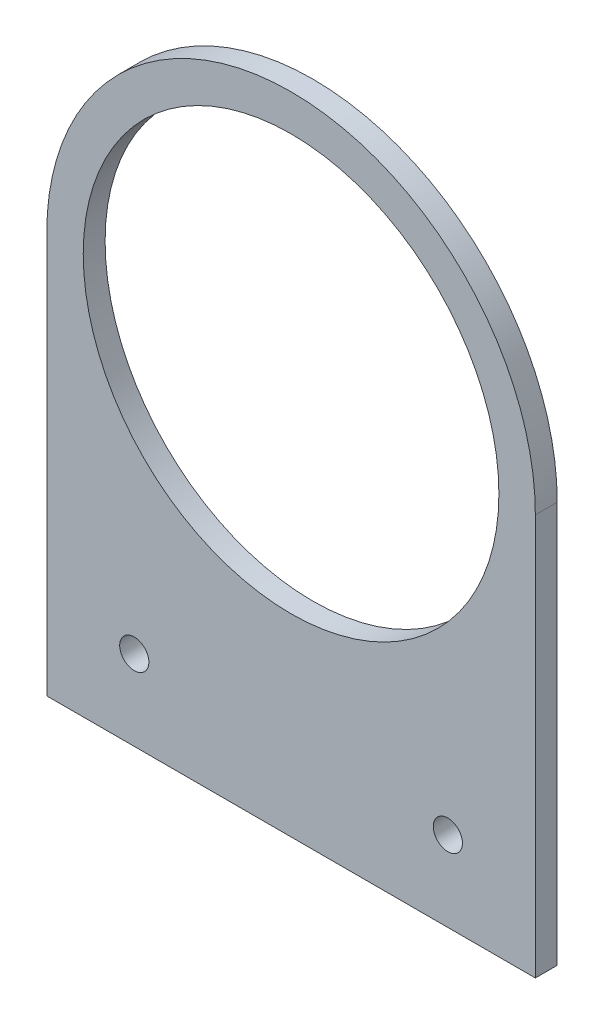
ISO-10303-21;
HEADER;
FILE_DESCRIPTION(('STEP AP214'),'2;1');
FILE_NAME('part.step','',(''),(''),'','','');
FILE_SCHEMA(('AUTOMOTIVE_DESIGN { 1 0 10303 214 1 1 1 1 }'));
ENDSEC;
DATA;
#1=APPLICATION_CONTEXT('core data for automotive mechanical design processes');
#2=APPLICATION_PROTOCOL_DEFINITION('international standard','automotive_design',2000,#1);
#3=PRODUCT_CONTEXT('',#1,'mechanical');
#4=PRODUCT('Part','Part','',(#3));
#5=PRODUCT_RELATED_PRODUCT_CATEGORY('part','',(#4));
#6=PRODUCT_DEFINITION_FORMATION('','',#4);
#7=PRODUCT_DEFINITION_CONTEXT('part definition',#1,'design');
#8=PRODUCT_DEFINITION('design','',#6,#7);
#9=PRODUCT_DEFINITION_SHAPE('','',#8);
#10=(LENGTH_UNIT() NAMED_UNIT(*) SI_UNIT(.MILLI.,.METRE.));
#11=(NAMED_UNIT(*) PLANE_ANGLE_UNIT() SI_UNIT($,.RADIAN.));
#12=(NAMED_UNIT(*) SI_UNIT($,.STERADIAN.) SOLID_ANGLE_UNIT());
#13=UNCERTAINTY_MEASURE_WITH_UNIT(LENGTH_MEASURE(1.E-05),#10,'distance_accuracy_value','');
#14=(GEOMETRIC_REPRESENTATION_CONTEXT(3) GLOBAL_UNCERTAINTY_ASSIGNED_CONTEXT((#13)) GLOBAL_UNIT_ASSIGNED_CONTEXT((#10,
#11,#12)) REPRESENTATION_CONTEXT('',''));
#15=CARTESIAN_POINT('',(0.,0.,0.));
#16=DIRECTION('',(0.,0.,1.));
#17=DIRECTION('',(1.,0.,0.));
#18=AXIS2_PLACEMENT_3D('',#15,#16,#17);
#19=CARTESIAN_POINT('',(0.,55.,3.));
#20=DIRECTION('',(0.,0.,1.));
#21=DIRECTION('',(1.,0.,0.));
#22=AXIS2_PLACEMENT_3D('',#19,#20,#21);
#23=PLANE('',#22);
#24=CARTESIAN_POINT('',(-21.5,11.,3.));
#25=DIRECTION('',(0.,0.,1.));
#26=DIRECTION('',(1.,0.,0.));
#27=AXIS2_PLACEMENT_3D('',#24,#25,#26);
#28=CIRCLE('',#27,2.);
#29=CARTESIAN_POINT('',(-19.5,11.,3.));
#30=VERTEX_POINT('',#29);
#31=EDGE_CURVE('E125',#30,#30,#28,.T.);
#32=ORIENTED_EDGE('',*,*,#31,.F.);
#33=EDGE_LOOP('',(#32));
#34=FACE_BOUND('',#33,.T.);
#35=DIRECTION('',(0.,-1.,0.));
#36=VECTOR('',#35,1.);
#37=CARTESIAN_POINT('',(-33.5,55.,3.));
#38=LINE('',#37,#36);
#39=CARTESIAN_POINT('',(-33.5,55.,3.));
#40=VERTEX_POINT('',#39);
#41=CARTESIAN_POINT('',(-33.5,0.,3.));
#42=VERTEX_POINT('',#41);
#43=EDGE_CURVE('E95',#40,#42,#38,.T.);
#44=ORIENTED_EDGE('',*,*,#43,.T.);
#45=DIRECTION('',(1.,0.,0.));
#46=VECTOR('',#45,1.);
#47=CARTESIAN_POINT('',(-33.5,0.,3.));
#48=LINE('',#47,#46);
#49=CARTESIAN_POINT('',(33.5,0.,3.));
#50=VERTEX_POINT('',#49);
#51=EDGE_CURVE('E90',#42,#50,#48,.T.);
#52=ORIENTED_EDGE('',*,*,#51,.T.);
#53=DIRECTION('',(0.,1.,0.));
#54=VECTOR('',#53,1.);
#55=CARTESIAN_POINT('',(33.5,0.,3.));
#56=LINE('',#55,#54);
#57=CARTESIAN_POINT('',(33.5,55.,3.));
#58=VERTEX_POINT('',#57);
#59=EDGE_CURVE('E93',#50,#58,#56,.T.);
#60=ORIENTED_EDGE('',*,*,#59,.T.);
#61=CARTESIAN_POINT('',(0.,55.,3.));
#62=DIRECTION('',(0.,0.,1.));
#63=DIRECTION('',(1.,0.,0.));
#64=AXIS2_PLACEMENT_3D('',#61,#62,#63);
#65=CIRCLE('',#64,33.5);
#66=EDGE_CURVE('E60',#58,#40,#65,.T.);
#67=ORIENTED_EDGE('',*,*,#66,.T.);
#68=EDGE_LOOP('',(#44,#52,#60,#67));
#69=FACE_BOUND('',#68,.T.);
#70=CARTESIAN_POINT('',(0.,55.,3.));
#71=DIRECTION('',(0.,0.,1.));
#72=DIRECTION('',(1.,0.,0.));
#73=AXIS2_PLACEMENT_3D('',#70,#71,#72);
#74=CIRCLE('',#73,28.5);
#75=CARTESIAN_POINT('',(28.5,55.,3.));
#76=VERTEX_POINT('',#75);
#77=EDGE_CURVE('E110',#76,#76,#74,.T.);
#78=ORIENTED_EDGE('',*,*,#77,.F.);
#79=EDGE_LOOP('',(#78));
#80=FACE_BOUND('',#79,.T.);
#81=CARTESIAN_POINT('',(21.5,11.,3.));
#82=DIRECTION('',(0.,0.,1.));
#83=DIRECTION('',(-1.,0.,0.));
#84=AXIS2_PLACEMENT_3D('',#81,#82,#83);
#85=CIRCLE('',#84,2.);
#86=CARTESIAN_POINT('',(19.5,11.,3.));
#87=VERTEX_POINT('',#86);
#88=EDGE_CURVE('E131',#87,#87,#85,.T.);
#89=ORIENTED_EDGE('',*,*,#88,.F.);
#90=EDGE_LOOP('',(#89));
#91=FACE_BOUND('',#90,.T.);
#92=ADVANCED_FACE('F43',(#34,#69,#80,#91),#23,.T.);
#93=CARTESIAN_POINT('',(0.,55.,0.));
#94=DIRECTION('',(0.,0.,1.));
#95=DIRECTION('',(1.,0.,0.));
#96=AXIS2_PLACEMENT_3D('',#93,#94,#95);
#97=PLANE('',#96);
#98=DIRECTION('',(0.,-1.,0.));
#99=VECTOR('',#98,1.);
#100=CARTESIAN_POINT('',(-33.5,55.,0.));
#101=LINE('',#100,#99);
#102=CARTESIAN_POINT('',(-33.5,55.,0.));
#103=VERTEX_POINT('',#102);
#104=CARTESIAN_POINT('',(-33.5,0.,0.));
#105=VERTEX_POINT('',#104);
#106=EDGE_CURVE('E107',#103,#105,#101,.T.);
#107=ORIENTED_EDGE('',*,*,#106,.F.);
#108=CARTESIAN_POINT('',(0.,55.,0.));
#109=DIRECTION('',(0.,0.,1.));
#110=DIRECTION('',(1.,0.,0.));
#111=AXIS2_PLACEMENT_3D('',#108,#109,#110);
#112=CIRCLE('',#111,33.5);
#113=CARTESIAN_POINT('',(33.5,55.,0.));
#114=VERTEX_POINT('',#113);
#115=EDGE_CURVE('E83',#114,#103,#112,.T.);
#116=ORIENTED_EDGE('',*,*,#115,.F.);
#117=DIRECTION('',(0.,1.,0.));
#118=VECTOR('',#117,1.);
#119=CARTESIAN_POINT('',(33.5,0.,0.));
#120=LINE('',#119,#118);
#121=CARTESIAN_POINT('',(33.5,0.,0.));
#122=VERTEX_POINT('',#121);
#123=EDGE_CURVE('E77',#122,#114,#120,.T.);
#124=ORIENTED_EDGE('',*,*,#123,.F.);
#125=DIRECTION('',(1.,0.,0.));
#126=VECTOR('',#125,1.);
#127=CARTESIAN_POINT('',(-33.5,0.,0.));
#128=LINE('',#127,#126);
#129=EDGE_CURVE('E99',#105,#122,#128,.T.);
#130=ORIENTED_EDGE('',*,*,#129,.F.);
#131=EDGE_LOOP('',(#107,#116,#124,#130));
#132=FACE_BOUND('',#131,.T.);
#133=CARTESIAN_POINT('',(0.,55.,0.));
#134=DIRECTION('',(0.,0.,1.));
#135=DIRECTION('',(1.,0.,0.));
#136=AXIS2_PLACEMENT_3D('',#133,#134,#135);
#137=CIRCLE('',#136,28.5);
#138=CARTESIAN_POINT('',(28.5,55.,0.));
#139=VERTEX_POINT('',#138);
#140=EDGE_CURVE('E122',#139,#139,#137,.T.);
#141=ORIENTED_EDGE('',*,*,#140,.T.);
#142=EDGE_LOOP('',(#141));
#143=FACE_BOUND('',#142,.T.);
#144=CARTESIAN_POINT('',(-21.5,11.,0.));
#145=DIRECTION('',(0.,0.,1.));
#146=DIRECTION('',(1.,0.,0.));
#147=AXIS2_PLACEMENT_3D('',#144,#145,#146);
#148=CIRCLE('',#147,2.);
#149=CARTESIAN_POINT('',(-19.5,11.,0.));
#150=VERTEX_POINT('',#149);
#151=EDGE_CURVE('E128',#150,#150,#148,.T.);
#152=ORIENTED_EDGE('',*,*,#151,.T.);
#153=EDGE_LOOP('',(#152));
#154=FACE_BOUND('',#153,.T.);
#155=CARTESIAN_POINT('',(21.5,11.,0.));
#156=DIRECTION('',(0.,0.,1.));
#157=DIRECTION('',(-1.,0.,0.));
#158=AXIS2_PLACEMENT_3D('',#155,#156,#157);
#159=CIRCLE('',#158,2.);
#160=CARTESIAN_POINT('',(19.5,11.,0.));
#161=VERTEX_POINT('',#160);
#162=EDGE_CURVE('E134',#161,#161,#159,.T.);
#163=ORIENTED_EDGE('',*,*,#162,.T.);
#164=EDGE_LOOP('',(#163));
#165=FACE_BOUND('',#164,.T.);
#166=ADVANCED_FACE('F118',(#132,#143,#154,#165),#97,.F.);
#167=CARTESIAN_POINT('',(-33.5,55.,3.));
#168=DIRECTION('',(1.,0.,0.));
#169=DIRECTION('',(0.,1.,0.));
#170=AXIS2_PLACEMENT_3D('',#167,#168,#169);
#171=PLANE('',#170);
#172=ORIENTED_EDGE('',*,*,#106,.T.);
#173=DIRECTION('',(0.,0.,-1.));
#174=VECTOR('',#173,1.);
#175=CARTESIAN_POINT('',(-33.5,0.,3.));
#176=LINE('',#175,#174);
#177=EDGE_CURVE('E11',#42,#105,#176,.T.);
#178=ORIENTED_EDGE('',*,*,#177,.F.);
#179=ORIENTED_EDGE('',*,*,#43,.F.);
#180=DIRECTION('',(0.,0.,-1.));
#181=VECTOR('',#180,1.);
#182=CARTESIAN_POINT('',(-33.5,55.,3.));
#183=LINE('',#182,#181);
#184=EDGE_CURVE('E103',#40,#103,#183,.T.);
#185=ORIENTED_EDGE('',*,*,#184,.T.);
#186=EDGE_LOOP('',(#172,#178,#179,#185));
#187=FACE_BOUND('',#186,.T.);
#188=ADVANCED_FACE('F45',(#187),#171,.F.);
#189=CARTESIAN_POINT('',(-33.5,0.,3.));
#190=DIRECTION('',(0.,1.,0.));
#191=DIRECTION('',(-1.,0.,0.));
#192=AXIS2_PLACEMENT_3D('',#189,#190,#191);
#193=PLANE('',#192);
#194=ORIENTED_EDGE('',*,*,#129,.T.);
#195=DIRECTION('',(0.,0.,-1.));
#196=VECTOR('',#195,1.);
#197=CARTESIAN_POINT('',(33.5,0.,3.));
#198=LINE('',#197,#196);
#199=EDGE_CURVE('E52',#50,#122,#198,.T.);
#200=ORIENTED_EDGE('',*,*,#199,.F.);
#201=ORIENTED_EDGE('',*,*,#51,.F.);
#202=ORIENTED_EDGE('',*,*,#177,.T.);
#203=EDGE_LOOP('',(#194,#200,#201,#202));
#204=FACE_BOUND('',#203,.T.);
#205=ADVANCED_FACE('F98',(#204),#193,.F.);
#206=CARTESIAN_POINT('',(33.5,0.,3.));
#207=DIRECTION('',(-1.,0.,0.));
#208=DIRECTION('',(0.,-1.,0.));
#209=AXIS2_PLACEMENT_3D('',#206,#207,#208);
#210=PLANE('',#209);
#211=ORIENTED_EDGE('',*,*,#123,.T.);
#212=DIRECTION('',(0.,0.,-1.));
#213=VECTOR('',#212,1.);
#214=CARTESIAN_POINT('',(33.5,55.,3.));
#215=LINE('',#214,#213);
#216=EDGE_CURVE('E100',#58,#114,#215,.T.);
#217=ORIENTED_EDGE('',*,*,#216,.F.);
#218=ORIENTED_EDGE('',*,*,#59,.F.);
#219=ORIENTED_EDGE('',*,*,#199,.T.);
#220=EDGE_LOOP('',(#211,#217,#218,#219));
#221=FACE_BOUND('',#220,.T.);
#222=ADVANCED_FACE('F101',(#221),#210,.F.);
#223=CARTESIAN_POINT('',(0.,55.,3.));
#224=DIRECTION('',(0.,0.,-1.));
#225=DIRECTION('',(-1.,0.,0.));
#226=AXIS2_PLACEMENT_3D('',#223,#224,#225);
#227=CYLINDRICAL_SURFACE('',#226,33.5);
#228=ORIENTED_EDGE('',*,*,#115,.T.);
#229=ORIENTED_EDGE('',*,*,#184,.F.);
#230=ORIENTED_EDGE('',*,*,#66,.F.);
#231=ORIENTED_EDGE('',*,*,#216,.T.);
#232=EDGE_LOOP('',(#228,#229,#230,#231));
#233=FACE_BOUND('',#232,.T.);
#234=ADVANCED_FACE('F115',(#233),#227,.T.);
#235=CARTESIAN_POINT('',(0.,55.,3.));
#236=DIRECTION('',(0.,0.,-1.));
#237=DIRECTION('',(-1.,0.,0.));
#238=AXIS2_PLACEMENT_3D('',#235,#236,#237);
#239=CYLINDRICAL_SURFACE('',#238,28.5);
#240=ORIENTED_EDGE('',*,*,#77,.T.);
#241=EDGE_LOOP('',(#240));
#242=FACE_BOUND('',#241,.T.);
#243=ORIENTED_EDGE('',*,*,#140,.F.);
#244=EDGE_LOOP('',(#243));
#245=FACE_BOUND('',#244,.T.);
#246=ADVANCED_FACE('F152',(#242,#245),#239,.F.);
#247=CARTESIAN_POINT('',(-21.5,11.,3.));
#248=DIRECTION('',(0.,0.,-1.));
#249=DIRECTION('',(-1.,0.,0.));
#250=AXIS2_PLACEMENT_3D('',#247,#248,#249);
#251=CYLINDRICAL_SURFACE('',#250,2.);
#252=ORIENTED_EDGE('',*,*,#31,.T.);
#253=EDGE_LOOP('',(#252));
#254=FACE_BOUND('',#253,.T.);
#255=ORIENTED_EDGE('',*,*,#151,.F.);
#256=EDGE_LOOP('',(#255));
#257=FACE_BOUND('',#256,.T.);
#258=ADVANCED_FACE('F197',(#254,#257),#251,.F.);
#259=CARTESIAN_POINT('',(21.5,11.,3.));
#260=DIRECTION('',(0.,0.,-1.));
#261=DIRECTION('',(-1.,0.,0.));
#262=AXIS2_PLACEMENT_3D('',#259,#260,#261);
#263=CYLINDRICAL_SURFACE('',#262,2.);
#264=ORIENTED_EDGE('',*,*,#88,.T.);
#265=EDGE_LOOP('',(#264));
#266=FACE_BOUND('',#265,.T.);
#267=ORIENTED_EDGE('',*,*,#162,.F.);
#268=EDGE_LOOP('',(#267));
#269=FACE_BOUND('',#268,.T.);
#270=ADVANCED_FACE('F140',(#266,#269),#263,.F.);
#271=CLOSED_SHELL('',(#92,#166,#188,#205,#222,#234,#246,#258,#270));
#272=MANIFOLD_SOLID_BREP('B2',#271);
#273=ADVANCED_BREP_SHAPE_REPRESENTATION('',(#18,#272),#14);
#274=SHAPE_DEFINITION_REPRESENTATION(#9,#273);
ENDSEC;
END-ISO-10303-21;
